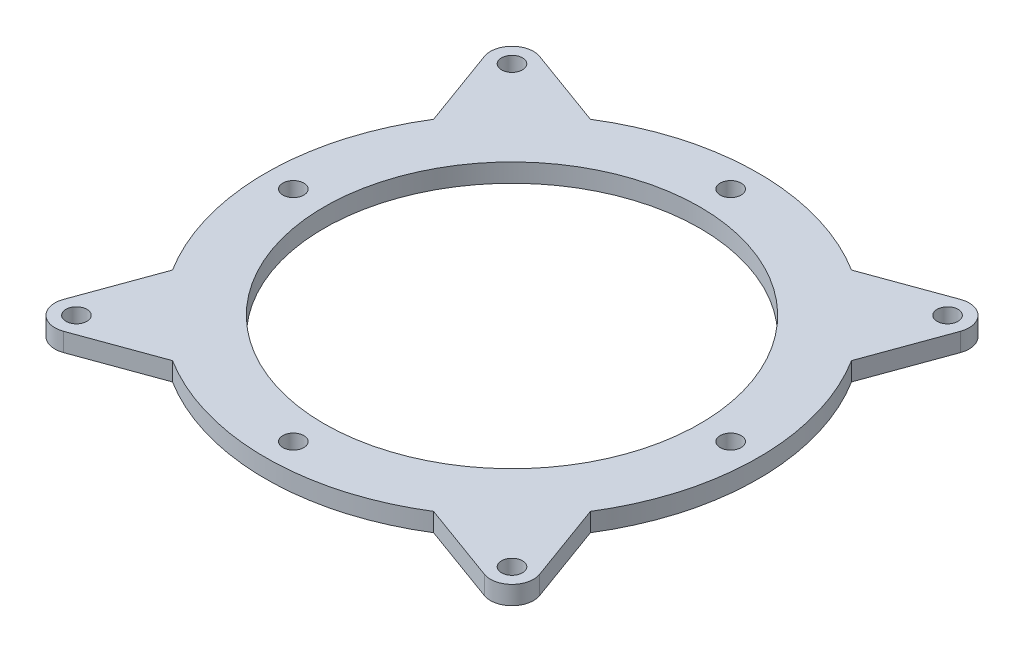
ISO-10303-21;
HEADER;
FILE_DESCRIPTION(('STEP AP214'),'2;1');
FILE_NAME('part.step','',(''),(''),'','','');
FILE_SCHEMA(('AUTOMOTIVE_DESIGN { 1 0 10303 214 1 1 1 1 }'));
ENDSEC;
DATA;
#1=APPLICATION_CONTEXT('core data for automotive mechanical design processes');
#2=APPLICATION_PROTOCOL_DEFINITION('international standard','automotive_design',2000,#1);
#3=PRODUCT_CONTEXT('',#1,'mechanical');
#4=PRODUCT('Part','Part','',(#3));
#5=PRODUCT_RELATED_PRODUCT_CATEGORY('part','',(#4));
#6=PRODUCT_DEFINITION_FORMATION('','',#4);
#7=PRODUCT_DEFINITION_CONTEXT('part definition',#1,'design');
#8=PRODUCT_DEFINITION('design','',#6,#7);
#9=PRODUCT_DEFINITION_SHAPE('','',#8);
#10=(LENGTH_UNIT() NAMED_UNIT(*) SI_UNIT(.MILLI.,.METRE.));
#11=(NAMED_UNIT(*) PLANE_ANGLE_UNIT() SI_UNIT($,.RADIAN.));
#12=(NAMED_UNIT(*) SI_UNIT($,.STERADIAN.) SOLID_ANGLE_UNIT());
#13=UNCERTAINTY_MEASURE_WITH_UNIT(LENGTH_MEASURE(1.E-05),#10,'distance_accuracy_value','');
#14=(GEOMETRIC_REPRESENTATION_CONTEXT(3) GLOBAL_UNCERTAINTY_ASSIGNED_CONTEXT((#13)) GLOBAL_UNIT_ASSIGNED_CONTEXT((#10,
#11,#12)) REPRESENTATION_CONTEXT('',''));
#15=CARTESIAN_POINT('',(0.,0.,0.));
#16=DIRECTION('',(0.,0.,1.));
#17=DIRECTION('',(1.,0.,0.));
#18=AXIS2_PLACEMENT_3D('',#15,#16,#17);
#19=CARTESIAN_POINT('',(35.3553390593273,3.,-35.3553390593275));
#20=DIRECTION('',(0.,1.,0.));
#21=DIRECTION('',(0.,0.,1.));
#22=AXIS2_PLACEMENT_3D('',#19,#20,#21);
#23=PLANE('',#22);
#24=CARTESIAN_POINT('',(-35.3553390593273,3.,35.3553390593275));
#25=DIRECTION('',(0.,1.,0.));
#26=DIRECTION('',(0.,0.,1.));
#27=AXIS2_PLACEMENT_3D('',#24,#25,#26);
#28=CIRCLE('',#27,1.69999999999999);
#29=CARTESIAN_POINT('',(-35.3553390593273,3.,37.0553390593275));
#30=VERTEX_POINT('',#29);
#31=EDGE_CURVE('E369',#30,#30,#28,.T.);
#32=ORIENTED_EDGE('',*,*,#31,.F.);
#33=EDGE_LOOP('',(#32));
#34=FACE_BOUND('',#33,.T.);
#35=CARTESIAN_POINT('',(-35.5,3.,0.));
#36=DIRECTION('',(0.,1.,0.));
#37=DIRECTION('',(0.,0.,1.));
#38=AXIS2_PLACEMENT_3D('',#35,#36,#37);
#39=CIRCLE('',#38,1.7);
#40=CARTESIAN_POINT('',(-35.5,3.,1.7));
#41=VERTEX_POINT('',#40);
#42=EDGE_CURVE('E381',#41,#41,#39,.T.);
#43=ORIENTED_EDGE('',*,*,#42,.F.);
#44=EDGE_LOOP('',(#43));
#45=FACE_BOUND('',#44,.T.);
#46=CARTESIAN_POINT('',(35.5,3.,0.));
#47=DIRECTION('',(0.,1.,0.));
#48=DIRECTION('',(0.,0.,1.));
#49=AXIS2_PLACEMENT_3D('',#46,#47,#48);
#50=CIRCLE('',#49,1.7);
#51=CARTESIAN_POINT('',(35.5,3.,1.7));
#52=VERTEX_POINT('',#51);
#53=EDGE_CURVE('E393',#52,#52,#50,.T.);
#54=ORIENTED_EDGE('',*,*,#53,.F.);
#55=EDGE_LOOP('',(#54));
#56=FACE_BOUND('',#55,.T.);
#57=CARTESIAN_POINT('',(0.,3.,0.));
#58=DIRECTION('',(0.,1.,0.));
#59=DIRECTION('',(0.,0.,1.));
#60=AXIS2_PLACEMENT_3D('',#57,#58,#59);
#61=CIRCLE('',#60,30.5);
#62=CARTESIAN_POINT('',(0.,3.,30.5));
#63=VERTEX_POINT('',#62);
#64=EDGE_CURVE('E405',#63,#63,#61,.T.);
#65=ORIENTED_EDGE('',*,*,#64,.F.);
#66=EDGE_LOOP('',(#65));
#67=FACE_BOUND('',#66,.T.);
#68=CARTESIAN_POINT('',(35.3553390593273,3.,-35.3553390593275));
#69=DIRECTION('',(0.,1.,0.));
#70=DIRECTION('',(0.,0.,1.));
#71=AXIS2_PLACEMENT_3D('',#68,#69,#70);
#72=CIRCLE('',#71,3.50000000000002);
#73=CARTESIAN_POINT('',(38.6442632320781,3.,-34.1582685576877));
#74=VERTEX_POINT('',#73);
#75=CARTESIAN_POINT('',(34.1582685576875,3.,-38.6442632320781));
#76=VERTEX_POINT('',#75);
#77=EDGE_CURVE('E215',#74,#76,#72,.T.);
#78=ORIENTED_EDGE('',*,*,#77,.T.);
#79=DIRECTION('',(-0.939692620785906,0.,0.342020143325677));
#80=VECTOR('',#79,1.);
#81=CARTESIAN_POINT('',(34.1582685576875,3.,-38.6442632320781));
#82=LINE('',#81,#80);
#83=CARTESIAN_POINT('',(21.1919766699055,3.,-33.9249189361181));
#84=VERTEX_POINT('',#83);
#85=EDGE_CURVE('E123',#76,#84,#82,.T.);
#86=ORIENTED_EDGE('',*,*,#85,.T.);
#87=CARTESIAN_POINT('',(0.,3.,0.));
#88=DIRECTION('',(0.,1.,0.));
#89=DIRECTION('',(0.,0.,1.));
#90=AXIS2_PLACEMENT_3D('',#87,#88,#89);
#91=CIRCLE('',#90,40.);
#92=CARTESIAN_POINT('',(-21.1919766699056,3.,-33.924918936118));
#93=VERTEX_POINT('',#92);
#94=EDGE_CURVE('E254',#84,#93,#91,.T.);
#95=ORIENTED_EDGE('',*,*,#94,.T.);
#96=DIRECTION('',(-0.939692620785906,0.,-0.342020143325674));
#97=VECTOR('',#96,1.);
#98=CARTESIAN_POINT('',(-34.1582685576876,3.,-38.644263232078));
#99=LINE('',#98,#97);
#100=CARTESIAN_POINT('',(-34.1582685576876,3.,-38.644263232078));
#101=VERTEX_POINT('',#100);
#102=EDGE_CURVE('E273',#93,#101,#99,.T.);
#103=ORIENTED_EDGE('',*,*,#102,.T.);
#104=CARTESIAN_POINT('',(-35.3553390593275,3.,-35.3553390593273));
#105=DIRECTION('',(0.,1.,0.));
#106=DIRECTION('',(0.,0.,1.));
#107=AXIS2_PLACEMENT_3D('',#104,#105,#106);
#108=CIRCLE('',#107,3.5);
#109=CARTESIAN_POINT('',(-38.6442632320781,3.,-34.1582685576875));
#110=VERTEX_POINT('',#109);
#111=EDGE_CURVE('E270',#101,#110,#108,.T.);
#112=ORIENTED_EDGE('',*,*,#111,.T.);
#113=DIRECTION('',(0.342020143325678,0.,0.939692620785905));
#114=VECTOR('',#113,1.);
#115=CARTESIAN_POINT('',(-38.6442632320782,3.,-34.1582685576875));
#116=LINE('',#115,#114);
#117=CARTESIAN_POINT('',(-33.924918936118,3.,-21.1919766699055));
#118=VERTEX_POINT('',#117);
#119=EDGE_CURVE('E272',#110,#118,#116,.T.);
#120=ORIENTED_EDGE('',*,*,#119,.T.);
#121=CARTESIAN_POINT('',(0.,3.,0.));
#122=DIRECTION('',(0.,1.,0.));
#123=DIRECTION('',(0.,0.,1.));
#124=AXIS2_PLACEMENT_3D('',#121,#122,#123);
#125=CIRCLE('',#124,40.);
#126=CARTESIAN_POINT('',(-33.924918936118,3.,21.1919766699056));
#127=VERTEX_POINT('',#126);
#128=EDGE_CURVE('E275',#118,#127,#125,.T.);
#129=ORIENTED_EDGE('',*,*,#128,.T.);
#130=DIRECTION('',(-0.342020143325674,0.,0.939692620785907));
#131=VECTOR('',#130,1.);
#132=CARTESIAN_POINT('',(-38.644263232078,3.,34.1582685576876));
#133=LINE('',#132,#131);
#134=CARTESIAN_POINT('',(-38.644263232078,3.,34.1582685576876));
#135=VERTEX_POINT('',#134);
#136=EDGE_CURVE('E281',#127,#135,#133,.T.);
#137=ORIENTED_EDGE('',*,*,#136,.T.);
#138=CARTESIAN_POINT('',(-35.3553390593273,3.,35.3553390593275));
#139=DIRECTION('',(0.,1.,0.));
#140=DIRECTION('',(0.,0.,1.));
#141=AXIS2_PLACEMENT_3D('',#138,#139,#140);
#142=CIRCLE('',#141,3.5);
#143=CARTESIAN_POINT('',(-34.1582685576875,3.,38.6442632320781));
#144=VERTEX_POINT('',#143);
#145=EDGE_CURVE('E283',#135,#144,#142,.T.);
#146=ORIENTED_EDGE('',*,*,#145,.T.);
#147=DIRECTION('',(0.939692620785905,0.,-0.342020143325678));
#148=VECTOR('',#147,1.);
#149=CARTESIAN_POINT('',(-34.1582685576875,3.,38.6442632320782));
#150=LINE('',#149,#148);
#151=CARTESIAN_POINT('',(-21.1919766699055,3.,33.924918936118));
#152=VERTEX_POINT('',#151);
#153=EDGE_CURVE('E285',#144,#152,#150,.T.);
#154=ORIENTED_EDGE('',*,*,#153,.T.);
#155=CARTESIAN_POINT('',(0.,3.,0.));
#156=DIRECTION('',(0.,1.,0.));
#157=DIRECTION('',(0.,0.,1.));
#158=AXIS2_PLACEMENT_3D('',#155,#156,#157);
#159=CIRCLE('',#158,40.);
#160=CARTESIAN_POINT('',(21.1919766699056,3.,33.924918936118));
#161=VERTEX_POINT('',#160);
#162=EDGE_CURVE('E287',#152,#161,#159,.T.);
#163=ORIENTED_EDGE('',*,*,#162,.T.);
#164=DIRECTION('',(0.939692620785906,0.,0.342020143325674));
#165=VECTOR('',#164,1.);
#166=CARTESIAN_POINT('',(34.1582685576876,3.,38.644263232078));
#167=LINE('',#166,#165);
#168=CARTESIAN_POINT('',(34.1582685576876,3.,38.644263232078));
#169=VERTEX_POINT('',#168);
#170=EDGE_CURVE('E289',#161,#169,#167,.T.);
#171=ORIENTED_EDGE('',*,*,#170,.T.);
#172=CARTESIAN_POINT('',(35.3553390593275,3.,35.3553390593273));
#173=DIRECTION('',(0.,1.,0.));
#174=DIRECTION('',(0.,0.,1.));
#175=AXIS2_PLACEMENT_3D('',#172,#173,#174);
#176=CIRCLE('',#175,3.5);
#177=CARTESIAN_POINT('',(38.6442632320781,3.,34.1582685576875));
#178=VERTEX_POINT('',#177);
#179=EDGE_CURVE('E166',#169,#178,#176,.T.);
#180=ORIENTED_EDGE('',*,*,#179,.T.);
#181=DIRECTION('',(-0.342020143325678,0.,-0.939692620785905));
#182=VECTOR('',#181,1.);
#183=CARTESIAN_POINT('',(38.6442632320781,3.,34.1582685576875));
#184=LINE('',#183,#182);
#185=CARTESIAN_POINT('',(33.924918936118,3.,21.1919766699055));
#186=VERTEX_POINT('',#185);
#187=EDGE_CURVE('E160',#178,#186,#184,.T.);
#188=ORIENTED_EDGE('',*,*,#187,.T.);
#189=CARTESIAN_POINT('',(0.,3.,0.));
#190=DIRECTION('',(0.,1.,0.));
#191=DIRECTION('',(0.,0.,1.));
#192=AXIS2_PLACEMENT_3D('',#189,#190,#191);
#193=CIRCLE('',#192,40.);
#194=CARTESIAN_POINT('',(33.924918936118,3.,-21.1919766699056));
#195=VERTEX_POINT('',#194);
#196=EDGE_CURVE('E164',#186,#195,#193,.T.);
#197=ORIENTED_EDGE('',*,*,#196,.T.);
#198=DIRECTION('',(0.342020143325675,0.,-0.939692620785906));
#199=VECTOR('',#198,1.);
#200=CARTESIAN_POINT('',(38.6442632320781,3.,-34.1582685576877));
#201=LINE('',#200,#199);
#202=EDGE_CURVE('E56',#195,#74,#201,.T.);
#203=ORIENTED_EDGE('',*,*,#202,.T.);
#204=EDGE_LOOP('',(#78,#86,#95,#103,#112,#120,#129,#137,#146,#154,#163,#171,#180,#188,#197,#203));
#205=FACE_BOUND('',#204,.T.);
#206=CARTESIAN_POINT('',(35.3553390593273,3.,-35.3553390593275));
#207=DIRECTION('',(0.,1.,0.));
#208=DIRECTION('',(0.,0.,1.));
#209=AXIS2_PLACEMENT_3D('',#206,#207,#208);
#210=CIRCLE('',#209,1.7);
#211=CARTESIAN_POINT('',(35.3553390593273,3.,-33.6553390593275));
#212=VERTEX_POINT('',#211);
#213=EDGE_CURVE('E188',#212,#212,#210,.T.);
#214=ORIENTED_EDGE('',*,*,#213,.F.);
#215=EDGE_LOOP('',(#214));
#216=FACE_BOUND('',#215,.T.);
#217=CARTESIAN_POINT('',(0.,3.,-35.5));
#218=DIRECTION('',(0.,1.,0.));
#219=DIRECTION('',(0.,0.,1.));
#220=AXIS2_PLACEMENT_3D('',#217,#218,#219);
#221=CIRCLE('',#220,1.7);
#222=CARTESIAN_POINT('',(0.,3.,-33.8));
#223=VERTEX_POINT('',#222);
#224=EDGE_CURVE('E399',#223,#223,#221,.T.);
#225=ORIENTED_EDGE('',*,*,#224,.F.);
#226=EDGE_LOOP('',(#225));
#227=FACE_BOUND('',#226,.T.);
#228=CARTESIAN_POINT('',(0.,3.,35.5));
#229=DIRECTION('',(0.,1.,0.));
#230=DIRECTION('',(0.,0.,1.));
#231=AXIS2_PLACEMENT_3D('',#228,#229,#230);
#232=CIRCLE('',#231,1.7);
#233=CARTESIAN_POINT('',(0.,3.,37.2));
#234=VERTEX_POINT('',#233);
#235=EDGE_CURVE('E387',#234,#234,#232,.T.);
#236=ORIENTED_EDGE('',*,*,#235,.F.);
#237=EDGE_LOOP('',(#236));
#238=FACE_BOUND('',#237,.T.);
#239=CARTESIAN_POINT('',(35.3553390593275,3.,35.3553390593273));
#240=DIRECTION('',(0.,1.,0.));
#241=DIRECTION('',(0.,0.,1.));
#242=AXIS2_PLACEMENT_3D('',#239,#240,#241);
#243=CIRCLE('',#242,1.7);
#244=CARTESIAN_POINT('',(35.3553390593275,3.,37.0553390593273));
#245=VERTEX_POINT('',#244);
#246=EDGE_CURVE('E375',#245,#245,#243,.T.);
#247=ORIENTED_EDGE('',*,*,#246,.F.);
#248=EDGE_LOOP('',(#247));
#249=FACE_BOUND('',#248,.T.);
#250=CARTESIAN_POINT('',(-35.3553390593275,3.,-35.3553390593273));
#251=DIRECTION('',(0.,1.,0.));
#252=DIRECTION('',(0.,0.,1.));
#253=AXIS2_PLACEMENT_3D('',#250,#251,#252);
#254=CIRCLE('',#253,1.7);
#255=CARTESIAN_POINT('',(-35.3553390593275,3.,-33.6553390593273));
#256=VERTEX_POINT('',#255);
#257=EDGE_CURVE('E360',#256,#256,#254,.T.);
#258=ORIENTED_EDGE('',*,*,#257,.F.);
#259=EDGE_LOOP('',(#258));
#260=FACE_BOUND('',#259,.T.);
#261=ADVANCED_FACE('F39',(#34,#45,#56,#67,#205,#216,#227,#238,#249,#260),#23,.T.);
#262=CARTESIAN_POINT('',(35.3553390593273,0.,-35.3553390593275));
#263=DIRECTION('',(0.,1.,0.));
#264=DIRECTION('',(0.,0.,1.));
#265=AXIS2_PLACEMENT_3D('',#262,#263,#264);
#266=PLANE('',#265);
#267=CARTESIAN_POINT('',(35.3553390593273,0.,-35.3553390593275));
#268=DIRECTION('',(0.,1.,0.));
#269=DIRECTION('',(0.,0.,1.));
#270=AXIS2_PLACEMENT_3D('',#267,#268,#269);
#271=CIRCLE('',#270,3.50000000000002);
#272=CARTESIAN_POINT('',(38.6442632320781,0.,-34.1582685576877));
#273=VERTEX_POINT('',#272);
#274=CARTESIAN_POINT('',(34.1582685576875,0.,-38.6442632320781));
#275=VERTEX_POINT('',#274);
#276=EDGE_CURVE('E184',#273,#275,#271,.T.);
#277=ORIENTED_EDGE('',*,*,#276,.F.);
#278=DIRECTION('',(0.342020143325675,0.,-0.939692620785906));
#279=VECTOR('',#278,1.);
#280=CARTESIAN_POINT('',(38.6442632320781,0.,-34.1582685576877));
#281=LINE('',#280,#279);
#282=CARTESIAN_POINT('',(33.924918936118,0.,-21.1919766699056));
#283=VERTEX_POINT('',#282);
#284=EDGE_CURVE('E115',#283,#273,#281,.T.);
#285=ORIENTED_EDGE('',*,*,#284,.F.);
#286=CARTESIAN_POINT('',(0.,0.,0.));
#287=DIRECTION('',(0.,1.,0.));
#288=DIRECTION('',(0.,0.,1.));
#289=AXIS2_PLACEMENT_3D('',#286,#287,#288);
#290=CIRCLE('',#289,40.);
#291=CARTESIAN_POINT('',(33.924918936118,0.,21.1919766699055));
#292=VERTEX_POINT('',#291);
#293=EDGE_CURVE('E109',#292,#283,#290,.T.);
#294=ORIENTED_EDGE('',*,*,#293,.F.);
#295=DIRECTION('',(-0.342020143325678,0.,-0.939692620785905));
#296=VECTOR('',#295,1.);
#297=CARTESIAN_POINT('',(38.6442632320781,0.,34.1582685576875));
#298=LINE('',#297,#296);
#299=CARTESIAN_POINT('',(38.6442632320781,0.,34.1582685576875));
#300=VERTEX_POINT('',#299);
#301=EDGE_CURVE('E174',#300,#292,#298,.T.);
#302=ORIENTED_EDGE('',*,*,#301,.F.);
#303=CARTESIAN_POINT('',(35.3553390593275,0.,35.3553390593273));
#304=DIRECTION('',(0.,1.,0.));
#305=DIRECTION('',(0.,0.,1.));
#306=AXIS2_PLACEMENT_3D('',#303,#304,#305);
#307=CIRCLE('',#306,3.5);
#308=CARTESIAN_POINT('',(34.1582685576876,0.,38.644263232078));
#309=VERTEX_POINT('',#308);
#310=EDGE_CURVE('E210',#309,#300,#307,.T.);
#311=ORIENTED_EDGE('',*,*,#310,.F.);
#312=DIRECTION('',(0.939692620785906,0.,0.342020143325674));
#313=VECTOR('',#312,1.);
#314=CARTESIAN_POINT('',(34.1582685576876,0.,38.644263232078));
#315=LINE('',#314,#313);
#316=CARTESIAN_POINT('',(21.1919766699056,0.,33.924918936118));
#317=VERTEX_POINT('',#316);
#318=EDGE_CURVE('E208',#317,#309,#315,.T.);
#319=ORIENTED_EDGE('',*,*,#318,.F.);
#320=CARTESIAN_POINT('',(0.,0.,0.));
#321=DIRECTION('',(0.,1.,0.));
#322=DIRECTION('',(0.,0.,1.));
#323=AXIS2_PLACEMENT_3D('',#320,#321,#322);
#324=CIRCLE('',#323,40.);
#325=CARTESIAN_POINT('',(-21.1919766699055,0.,33.924918936118));
#326=VERTEX_POINT('',#325);
#327=EDGE_CURVE('E206',#326,#317,#324,.T.);
#328=ORIENTED_EDGE('',*,*,#327,.F.);
#329=DIRECTION('',(0.939692620785905,0.,-0.342020143325678));
#330=VECTOR('',#329,1.);
#331=CARTESIAN_POINT('',(-34.1582685576875,0.,38.6442632320782));
#332=LINE('',#331,#330);
#333=CARTESIAN_POINT('',(-34.1582685576875,0.,38.6442632320781));
#334=VERTEX_POINT('',#333);
#335=EDGE_CURVE('E204',#334,#326,#332,.T.);
#336=ORIENTED_EDGE('',*,*,#335,.F.);
#337=CARTESIAN_POINT('',(-35.3553390593273,0.,35.3553390593275));
#338=DIRECTION('',(0.,1.,0.));
#339=DIRECTION('',(0.,0.,1.));
#340=AXIS2_PLACEMENT_3D('',#337,#338,#339);
#341=CIRCLE('',#340,3.5);
#342=CARTESIAN_POINT('',(-38.644263232078,0.,34.1582685576876));
#343=VERTEX_POINT('',#342);
#344=EDGE_CURVE('E202',#343,#334,#341,.T.);
#345=ORIENTED_EDGE('',*,*,#344,.F.);
#346=DIRECTION('',(-0.342020143325674,0.,0.939692620785907));
#347=VECTOR('',#346,1.);
#348=CARTESIAN_POINT('',(-38.644263232078,0.,34.1582685576876));
#349=LINE('',#348,#347);
#350=CARTESIAN_POINT('',(-33.924918936118,0.,21.1919766699056));
#351=VERTEX_POINT('',#350);
#352=EDGE_CURVE('E200',#351,#343,#349,.T.);
#353=ORIENTED_EDGE('',*,*,#352,.F.);
#354=CARTESIAN_POINT('',(0.,0.,0.));
#355=DIRECTION('',(0.,1.,0.));
#356=DIRECTION('',(0.,0.,1.));
#357=AXIS2_PLACEMENT_3D('',#354,#355,#356);
#358=CIRCLE('',#357,40.);
#359=CARTESIAN_POINT('',(-33.924918936118,0.,-21.1919766699055));
#360=VERTEX_POINT('',#359);
#361=EDGE_CURVE('E198',#360,#351,#358,.T.);
#362=ORIENTED_EDGE('',*,*,#361,.F.);
#363=DIRECTION('',(0.342020143325678,0.,0.939692620785905));
#364=VECTOR('',#363,1.);
#365=CARTESIAN_POINT('',(-38.6442632320782,0.,-34.1582685576875));
#366=LINE('',#365,#364);
#367=CARTESIAN_POINT('',(-38.6442632320781,0.,-34.1582685576875));
#368=VERTEX_POINT('',#367);
#369=EDGE_CURVE('E196',#368,#360,#366,.T.);
#370=ORIENTED_EDGE('',*,*,#369,.F.);
#371=CARTESIAN_POINT('',(-35.3553390593275,0.,-35.3553390593273));
#372=DIRECTION('',(0.,1.,0.));
#373=DIRECTION('',(0.,0.,1.));
#374=AXIS2_PLACEMENT_3D('',#371,#372,#373);
#375=CIRCLE('',#374,3.5);
#376=CARTESIAN_POINT('',(-34.1582685576876,0.,-38.644263232078));
#377=VERTEX_POINT('',#376);
#378=EDGE_CURVE('E194',#377,#368,#375,.T.);
#379=ORIENTED_EDGE('',*,*,#378,.F.);
#380=DIRECTION('',(-0.939692620785906,0.,-0.342020143325674));
#381=VECTOR('',#380,1.);
#382=CARTESIAN_POINT('',(-34.1582685576876,0.,-38.644263232078));
#383=LINE('',#382,#381);
#384=CARTESIAN_POINT('',(-21.1919766699056,0.,-33.924918936118));
#385=VERTEX_POINT('',#384);
#386=EDGE_CURVE('E192',#385,#377,#383,.T.);
#387=ORIENTED_EDGE('',*,*,#386,.F.);
#388=CARTESIAN_POINT('',(0.,0.,0.));
#389=DIRECTION('',(0.,1.,0.));
#390=DIRECTION('',(0.,0.,1.));
#391=AXIS2_PLACEMENT_3D('',#388,#389,#390);
#392=CIRCLE('',#391,40.);
#393=CARTESIAN_POINT('',(21.1919766699055,0.,-33.9249189361181));
#394=VERTEX_POINT('',#393);
#395=EDGE_CURVE('E190',#394,#385,#392,.T.);
#396=ORIENTED_EDGE('',*,*,#395,.F.);
#397=DIRECTION('',(-0.939692620785906,0.,0.342020143325677));
#398=VECTOR('',#397,1.);
#399=CARTESIAN_POINT('',(34.1582685576875,0.,-38.6442632320781));
#400=LINE('',#399,#398);
#401=EDGE_CURVE('E187',#275,#394,#400,.T.);
#402=ORIENTED_EDGE('',*,*,#401,.F.);
#403=EDGE_LOOP('',(#277,#285,#294,#302,#311,#319,#328,#336,#345,#353,#362,#370,#379,#387,#396,#402));
#404=FACE_BOUND('',#403,.T.);
#405=CARTESIAN_POINT('',(35.3553390593273,0.,-35.3553390593275));
#406=DIRECTION('',(0.,1.,0.));
#407=DIRECTION('',(0.,0.,1.));
#408=AXIS2_PLACEMENT_3D('',#405,#406,#407);
#409=CIRCLE('',#408,1.7);
#410=CARTESIAN_POINT('',(35.3553390593273,0.,-33.6553390593275));
#411=VERTEX_POINT('',#410);
#412=EDGE_CURVE('E408',#411,#411,#409,.T.);
#413=ORIENTED_EDGE('',*,*,#412,.T.);
#414=EDGE_LOOP('',(#413));
#415=FACE_BOUND('',#414,.T.);
#416=CARTESIAN_POINT('',(0.,0.,0.));
#417=DIRECTION('',(0.,1.,0.));
#418=DIRECTION('',(0.,0.,1.));
#419=AXIS2_PLACEMENT_3D('',#416,#417,#418);
#420=CIRCLE('',#419,30.5);
#421=CARTESIAN_POINT('',(0.,0.,30.5));
#422=VERTEX_POINT('',#421);
#423=EDGE_CURVE('E402',#422,#422,#420,.T.);
#424=ORIENTED_EDGE('',*,*,#423,.T.);
#425=EDGE_LOOP('',(#424));
#426=FACE_BOUND('',#425,.T.);
#427=CARTESIAN_POINT('',(0.,0.,-35.5));
#428=DIRECTION('',(0.,1.,0.));
#429=DIRECTION('',(0.,0.,1.));
#430=AXIS2_PLACEMENT_3D('',#427,#428,#429);
#431=CIRCLE('',#430,1.7);
#432=CARTESIAN_POINT('',(0.,0.,-33.8));
#433=VERTEX_POINT('',#432);
#434=EDGE_CURVE('E396',#433,#433,#431,.T.);
#435=ORIENTED_EDGE('',*,*,#434,.T.);
#436=EDGE_LOOP('',(#435));
#437=FACE_BOUND('',#436,.T.);
#438=CARTESIAN_POINT('',(35.5,0.,0.));
#439=DIRECTION('',(0.,1.,0.));
#440=DIRECTION('',(0.,0.,1.));
#441=AXIS2_PLACEMENT_3D('',#438,#439,#440);
#442=CIRCLE('',#441,1.7);
#443=CARTESIAN_POINT('',(35.5,0.,1.7));
#444=VERTEX_POINT('',#443);
#445=EDGE_CURVE('E390',#444,#444,#442,.T.);
#446=ORIENTED_EDGE('',*,*,#445,.T.);
#447=EDGE_LOOP('',(#446));
#448=FACE_BOUND('',#447,.T.);
#449=CARTESIAN_POINT('',(0.,0.,35.5));
#450=DIRECTION('',(0.,1.,0.));
#451=DIRECTION('',(0.,0.,1.));
#452=AXIS2_PLACEMENT_3D('',#449,#450,#451);
#453=CIRCLE('',#452,1.7);
#454=CARTESIAN_POINT('',(0.,0.,37.2));
#455=VERTEX_POINT('',#454);
#456=EDGE_CURVE('E384',#455,#455,#453,.T.);
#457=ORIENTED_EDGE('',*,*,#456,.T.);
#458=EDGE_LOOP('',(#457));
#459=FACE_BOUND('',#458,.T.);
#460=CARTESIAN_POINT('',(-35.5,0.,0.));
#461=DIRECTION('',(0.,1.,0.));
#462=DIRECTION('',(0.,0.,1.));
#463=AXIS2_PLACEMENT_3D('',#460,#461,#462);
#464=CIRCLE('',#463,1.7);
#465=CARTESIAN_POINT('',(-35.5,0.,1.7));
#466=VERTEX_POINT('',#465);
#467=EDGE_CURVE('E378',#466,#466,#464,.T.);
#468=ORIENTED_EDGE('',*,*,#467,.T.);
#469=EDGE_LOOP('',(#468));
#470=FACE_BOUND('',#469,.T.);
#471=CARTESIAN_POINT('',(35.3553390593275,0.,35.3553390593273));
#472=DIRECTION('',(0.,1.,0.));
#473=DIRECTION('',(0.,0.,1.));
#474=AXIS2_PLACEMENT_3D('',#471,#472,#473);
#475=CIRCLE('',#474,1.7);
#476=CARTESIAN_POINT('',(35.3553390593275,0.,37.0553390593273));
#477=VERTEX_POINT('',#476);
#478=EDGE_CURVE('E372',#477,#477,#475,.T.);
#479=ORIENTED_EDGE('',*,*,#478,.T.);
#480=EDGE_LOOP('',(#479));
#481=FACE_BOUND('',#480,.T.);
#482=CARTESIAN_POINT('',(-35.3553390593273,0.,35.3553390593275));
#483=DIRECTION('',(0.,1.,0.));
#484=DIRECTION('',(0.,0.,1.));
#485=AXIS2_PLACEMENT_3D('',#482,#483,#484);
#486=CIRCLE('',#485,1.69999999999999);
#487=CARTESIAN_POINT('',(-35.3553390593273,0.,37.0553390593275));
#488=VERTEX_POINT('',#487);
#489=EDGE_CURVE('E366',#488,#488,#486,.T.);
#490=ORIENTED_EDGE('',*,*,#489,.T.);
#491=EDGE_LOOP('',(#490));
#492=FACE_BOUND('',#491,.T.);
#493=CARTESIAN_POINT('',(-35.3553390593275,0.,-35.3553390593273));
#494=DIRECTION('',(0.,1.,0.));
#495=DIRECTION('',(0.,0.,1.));
#496=AXIS2_PLACEMENT_3D('',#493,#494,#495);
#497=CIRCLE('',#496,1.7);
#498=CARTESIAN_POINT('',(-35.3553390593275,0.,-33.6553390593273));
#499=VERTEX_POINT('',#498);
#500=EDGE_CURVE('E363',#499,#499,#497,.T.);
#501=ORIENTED_EDGE('',*,*,#500,.T.);
#502=EDGE_LOOP('',(#501));
#503=FACE_BOUND('',#502,.T.);
#504=ADVANCED_FACE('F258',(#404,#415,#426,#437,#448,#459,#470,#481,#492,#503),#266,.F.);
#505=CARTESIAN_POINT('',(35.3553390593273,3.,-35.3553390593275));
#506=DIRECTION('',(0.,-1.,0.));
#507=DIRECTION('',(0.,0.,-1.));
#508=AXIS2_PLACEMENT_3D('',#505,#506,#507);
#509=CYLINDRICAL_SURFACE('',#508,3.50000000000002);
#510=ORIENTED_EDGE('',*,*,#276,.T.);
#511=DIRECTION('',(0.,-1.,0.));
#512=VECTOR('',#511,1.);
#513=CARTESIAN_POINT('',(34.1582685576875,3.,-38.6442632320781));
#514=LINE('',#513,#512);
#515=EDGE_CURVE('E11',#76,#275,#514,.T.);
#516=ORIENTED_EDGE('',*,*,#515,.F.);
#517=ORIENTED_EDGE('',*,*,#77,.F.);
#518=DIRECTION('',(0.,-1.,0.));
#519=VECTOR('',#518,1.);
#520=CARTESIAN_POINT('',(38.6442632320781,3.,-34.1582685576877));
#521=LINE('',#520,#519);
#522=EDGE_CURVE('E180',#74,#273,#521,.T.);
#523=ORIENTED_EDGE('',*,*,#522,.T.);
#524=EDGE_LOOP('',(#510,#516,#517,#523));
#525=FACE_BOUND('',#524,.T.);
#526=ADVANCED_FACE('F41',(#525),#509,.T.);
#527=CARTESIAN_POINT('',(34.1582685576875,3.,-38.6442632320781));
#528=DIRECTION('',(0.342020143325677,0.,0.939692620785905));
#529=DIRECTION('',(0.939692620785905,0.,-0.342020143325677));
#530=AXIS2_PLACEMENT_3D('',#527,#528,#529);
#531=PLANE('',#530);
#532=ORIENTED_EDGE('',*,*,#401,.T.);
#533=DIRECTION('',(0.,-1.,0.));
#534=VECTOR('',#533,1.);
#535=CARTESIAN_POINT('',(21.1919766699055,3.,-33.9249189361181));
#536=LINE('',#535,#534);
#537=EDGE_CURVE('E48',#84,#394,#536,.T.);
#538=ORIENTED_EDGE('',*,*,#537,.F.);
#539=ORIENTED_EDGE('',*,*,#85,.F.);
#540=ORIENTED_EDGE('',*,*,#515,.T.);
#541=EDGE_LOOP('',(#532,#538,#539,#540));
#542=FACE_BOUND('',#541,.T.);
#543=ADVANCED_FACE('F612',(#542),#531,.F.);
#544=CARTESIAN_POINT('',(0.,3.,0.));
#545=DIRECTION('',(0.,-1.,0.));
#546=DIRECTION('',(0.,0.,-1.));
#547=AXIS2_PLACEMENT_3D('',#544,#545,#546);
#548=CYLINDRICAL_SURFACE('',#547,40.);
#549=ORIENTED_EDGE('',*,*,#395,.T.);
#550=DIRECTION('',(0.,-1.,0.));
#551=VECTOR('',#550,1.);
#552=CARTESIAN_POINT('',(-21.1919766699056,3.,-33.924918936118));
#553=LINE('',#552,#551);
#554=EDGE_CURVE('E246',#93,#385,#553,.T.);
#555=ORIENTED_EDGE('',*,*,#554,.F.);
#556=ORIENTED_EDGE('',*,*,#94,.F.);
#557=ORIENTED_EDGE('',*,*,#537,.T.);
#558=EDGE_LOOP('',(#549,#555,#556,#557));
#559=FACE_BOUND('',#558,.T.);
#560=ADVANCED_FACE('F252',(#559),#548,.T.);
#561=CARTESIAN_POINT('',(-34.1582685576876,3.,-38.644263232078));
#562=DIRECTION('',(-0.342020143325674,0.,0.939692620785906));
#563=DIRECTION('',(0.939692620785907,0.,0.342020143325674));
#564=AXIS2_PLACEMENT_3D('',#561,#562,#563);
#565=PLANE('',#564);
#566=ORIENTED_EDGE('',*,*,#386,.T.);
#567=DIRECTION('',(0.,-1.,0.));
#568=VECTOR('',#567,1.);
#569=CARTESIAN_POINT('',(-34.1582685576876,3.,-38.644263232078));
#570=LINE('',#569,#568);
#571=EDGE_CURVE('E243',#101,#377,#570,.T.);
#572=ORIENTED_EDGE('',*,*,#571,.F.);
#573=ORIENTED_EDGE('',*,*,#102,.F.);
#574=ORIENTED_EDGE('',*,*,#554,.T.);
#575=EDGE_LOOP('',(#566,#572,#573,#574));
#576=FACE_BOUND('',#575,.T.);
#577=ADVANCED_FACE('F264',(#576),#565,.F.);
#578=CARTESIAN_POINT('',(-35.3553390593275,3.,-35.3553390593273));
#579=DIRECTION('',(0.,-1.,0.));
#580=DIRECTION('',(0.,0.,-1.));
#581=AXIS2_PLACEMENT_3D('',#578,#579,#580);
#582=CYLINDRICAL_SURFACE('',#581,3.5);
#583=ORIENTED_EDGE('',*,*,#378,.T.);
#584=DIRECTION('',(0.,-1.,0.));
#585=VECTOR('',#584,1.);
#586=CARTESIAN_POINT('',(-38.6442632320781,3.,-34.1582685576875));
#587=LINE('',#586,#585);
#588=EDGE_CURVE('E240',#110,#368,#587,.T.);
#589=ORIENTED_EDGE('',*,*,#588,.F.);
#590=ORIENTED_EDGE('',*,*,#111,.F.);
#591=ORIENTED_EDGE('',*,*,#571,.T.);
#592=EDGE_LOOP('',(#583,#589,#590,#591));
#593=FACE_BOUND('',#592,.T.);
#594=ADVANCED_FACE('F268',(#593),#582,.T.);
#595=CARTESIAN_POINT('',(-38.6442632320782,3.,-34.1582685576875));
#596=DIRECTION('',(0.939692620785905,0.,-0.342020143325678));
#597=DIRECTION('',(-0.342020143325678,0.,-0.939692620785905));
#598=AXIS2_PLACEMENT_3D('',#595,#596,#597);
#599=PLANE('',#598);
#600=ORIENTED_EDGE('',*,*,#369,.T.);
#601=DIRECTION('',(0.,-1.,0.));
#602=VECTOR('',#601,1.);
#603=CARTESIAN_POINT('',(-33.924918936118,3.,-21.1919766699055));
#604=LINE('',#603,#602);
#605=EDGE_CURVE('E237',#118,#360,#604,.T.);
#606=ORIENTED_EDGE('',*,*,#605,.F.);
#607=ORIENTED_EDGE('',*,*,#119,.F.);
#608=ORIENTED_EDGE('',*,*,#588,.T.);
#609=EDGE_LOOP('',(#600,#606,#607,#608));
#610=FACE_BOUND('',#609,.T.);
#611=ADVANCED_FACE('F577',(#610),#599,.F.);
#612=CARTESIAN_POINT('',(0.,3.,0.));
#613=DIRECTION('',(0.,-1.,0.));
#614=DIRECTION('',(0.,0.,-1.));
#615=AXIS2_PLACEMENT_3D('',#612,#613,#614);
#616=CYLINDRICAL_SURFACE('',#615,40.);
#617=ORIENTED_EDGE('',*,*,#361,.T.);
#618=DIRECTION('',(0.,-1.,0.));
#619=VECTOR('',#618,1.);
#620=CARTESIAN_POINT('',(-33.924918936118,3.,21.1919766699056));
#621=LINE('',#620,#619);
#622=EDGE_CURVE('E234',#127,#351,#621,.T.);
#623=ORIENTED_EDGE('',*,*,#622,.F.);
#624=ORIENTED_EDGE('',*,*,#128,.F.);
#625=ORIENTED_EDGE('',*,*,#605,.T.);
#626=EDGE_LOOP('',(#617,#623,#624,#625));
#627=FACE_BOUND('',#626,.T.);
#628=ADVANCED_FACE('F567',(#627),#616,.T.);
#629=CARTESIAN_POINT('',(-38.644263232078,3.,34.1582685576876));
#630=DIRECTION('',(0.939692620785906,0.,0.342020143325674));
#631=DIRECTION('',(0.342020143325674,0.,-0.939692620785907));
#632=AXIS2_PLACEMENT_3D('',#629,#630,#631);
#633=PLANE('',#632);
#634=ORIENTED_EDGE('',*,*,#352,.T.);
#635=DIRECTION('',(0.,-1.,0.));
#636=VECTOR('',#635,1.);
#637=CARTESIAN_POINT('',(-38.644263232078,3.,34.1582685576876));
#638=LINE('',#637,#636);
#639=EDGE_CURVE('E231',#135,#343,#638,.T.);
#640=ORIENTED_EDGE('',*,*,#639,.F.);
#641=ORIENTED_EDGE('',*,*,#136,.F.);
#642=ORIENTED_EDGE('',*,*,#622,.T.);
#643=EDGE_LOOP('',(#634,#640,#641,#642));
#644=FACE_BOUND('',#643,.T.);
#645=ADVANCED_FACE('F557',(#644),#633,.F.);
#646=CARTESIAN_POINT('',(-35.3553390593273,3.,35.3553390593275));
#647=DIRECTION('',(0.,-1.,0.));
#648=DIRECTION('',(0.,0.,-1.));
#649=AXIS2_PLACEMENT_3D('',#646,#647,#648);
#650=CYLINDRICAL_SURFACE('',#649,3.5);
#651=ORIENTED_EDGE('',*,*,#344,.T.);
#652=DIRECTION('',(0.,-1.,0.));
#653=VECTOR('',#652,1.);
#654=CARTESIAN_POINT('',(-34.1582685576875,3.,38.6442632320781));
#655=LINE('',#654,#653);
#656=EDGE_CURVE('E228',#144,#334,#655,.T.);
#657=ORIENTED_EDGE('',*,*,#656,.F.);
#658=ORIENTED_EDGE('',*,*,#145,.F.);
#659=ORIENTED_EDGE('',*,*,#639,.T.);
#660=EDGE_LOOP('',(#651,#657,#658,#659));
#661=FACE_BOUND('',#660,.T.);
#662=ADVANCED_FACE('F547',(#661),#650,.T.);
#663=CARTESIAN_POINT('',(-34.1582685576875,3.,38.6442632320782));
#664=DIRECTION('',(-0.342020143325678,0.,-0.939692620785905));
#665=DIRECTION('',(-0.939692620785905,0.,0.342020143325678));
#666=AXIS2_PLACEMENT_3D('',#663,#664,#665);
#667=PLANE('',#666);
#668=ORIENTED_EDGE('',*,*,#335,.T.);
#669=DIRECTION('',(0.,-1.,0.));
#670=VECTOR('',#669,1.);
#671=CARTESIAN_POINT('',(-21.1919766699055,3.,33.924918936118));
#672=LINE('',#671,#670);
#673=EDGE_CURVE('E225',#152,#326,#672,.T.);
#674=ORIENTED_EDGE('',*,*,#673,.F.);
#675=ORIENTED_EDGE('',*,*,#153,.F.);
#676=ORIENTED_EDGE('',*,*,#656,.T.);
#677=EDGE_LOOP('',(#668,#674,#675,#676));
#678=FACE_BOUND('',#677,.T.);
#679=ADVANCED_FACE('F537',(#678),#667,.F.);
#680=CARTESIAN_POINT('',(0.,3.,0.));
#681=DIRECTION('',(0.,-1.,0.));
#682=DIRECTION('',(0.,0.,-1.));
#683=AXIS2_PLACEMENT_3D('',#680,#681,#682);
#684=CYLINDRICAL_SURFACE('',#683,40.);
#685=ORIENTED_EDGE('',*,*,#327,.T.);
#686=DIRECTION('',(0.,-1.,0.));
#687=VECTOR('',#686,1.);
#688=CARTESIAN_POINT('',(21.1919766699056,3.,33.924918936118));
#689=LINE('',#688,#687);
#690=EDGE_CURVE('E222',#161,#317,#689,.T.);
#691=ORIENTED_EDGE('',*,*,#690,.F.);
#692=ORIENTED_EDGE('',*,*,#162,.F.);
#693=ORIENTED_EDGE('',*,*,#673,.T.);
#694=EDGE_LOOP('',(#685,#691,#692,#693));
#695=FACE_BOUND('',#694,.T.);
#696=ADVANCED_FACE('F528',(#695),#684,.T.);
#697=CARTESIAN_POINT('',(34.1582685576876,3.,38.644263232078));
#698=DIRECTION('',(0.342020143325674,0.,-0.939692620785906));
#699=DIRECTION('',(-0.939692620785907,0.,-0.342020143325674));
#700=AXIS2_PLACEMENT_3D('',#697,#698,#699);
#701=PLANE('',#700);
#702=ORIENTED_EDGE('',*,*,#318,.T.);
#703=DIRECTION('',(0.,-1.,0.));
#704=VECTOR('',#703,1.);
#705=CARTESIAN_POINT('',(34.1582685576876,3.,38.644263232078));
#706=LINE('',#705,#704);
#707=EDGE_CURVE('E219',#169,#309,#706,.T.);
#708=ORIENTED_EDGE('',*,*,#707,.F.);
#709=ORIENTED_EDGE('',*,*,#170,.F.);
#710=ORIENTED_EDGE('',*,*,#690,.T.);
#711=EDGE_LOOP('',(#702,#708,#709,#710));
#712=FACE_BOUND('',#711,.T.);
#713=ADVANCED_FACE('F295',(#712),#701,.F.);
#714=CARTESIAN_POINT('',(35.3553390593275,3.,35.3553390593273));
#715=DIRECTION('',(0.,-1.,0.));
#716=DIRECTION('',(0.,0.,-1.));
#717=AXIS2_PLACEMENT_3D('',#714,#715,#716);
#718=CYLINDRICAL_SURFACE('',#717,3.5);
#719=ORIENTED_EDGE('',*,*,#310,.T.);
#720=DIRECTION('',(0.,-1.,0.));
#721=VECTOR('',#720,1.);
#722=CARTESIAN_POINT('',(38.6442632320781,3.,34.1582685576875));
#723=LINE('',#722,#721);
#724=EDGE_CURVE('E175',#178,#300,#723,.T.);
#725=ORIENTED_EDGE('',*,*,#724,.F.);
#726=ORIENTED_EDGE('',*,*,#179,.F.);
#727=ORIENTED_EDGE('',*,*,#707,.T.);
#728=EDGE_LOOP('',(#719,#725,#726,#727));
#729=FACE_BOUND('',#728,.T.);
#730=ADVANCED_FACE('F299',(#729),#718,.T.);
#731=CARTESIAN_POINT('',(38.6442632320781,3.,34.1582685576875));
#732=DIRECTION('',(-0.939692620785905,0.,0.342020143325678));
#733=DIRECTION('',(0.342020143325678,0.,0.939692620785905));
#734=AXIS2_PLACEMENT_3D('',#731,#732,#733);
#735=PLANE('',#734);
#736=ORIENTED_EDGE('',*,*,#301,.T.);
#737=DIRECTION('',(0.,-1.,0.));
#738=VECTOR('',#737,1.);
#739=CARTESIAN_POINT('',(33.924918936118,3.,21.1919766699055));
#740=LINE('',#739,#738);
#741=EDGE_CURVE('E171',#186,#292,#740,.T.);
#742=ORIENTED_EDGE('',*,*,#741,.F.);
#743=ORIENTED_EDGE('',*,*,#187,.F.);
#744=ORIENTED_EDGE('',*,*,#724,.T.);
#745=EDGE_LOOP('',(#736,#742,#743,#744));
#746=FACE_BOUND('',#745,.T.);
#747=ADVANCED_FACE('F172',(#746),#735,.F.);
#748=CARTESIAN_POINT('',(0.,3.,0.));
#749=DIRECTION('',(0.,-1.,0.));
#750=DIRECTION('',(0.,0.,-1.));
#751=AXIS2_PLACEMENT_3D('',#748,#749,#750);
#752=CYLINDRICAL_SURFACE('',#751,40.);
#753=ORIENTED_EDGE('',*,*,#293,.T.);
#754=DIRECTION('',(0.,-1.,0.));
#755=VECTOR('',#754,1.);
#756=CARTESIAN_POINT('',(33.924918936118,3.,-21.1919766699056));
#757=LINE('',#756,#755);
#758=EDGE_CURVE('E176',#195,#283,#757,.T.);
#759=ORIENTED_EDGE('',*,*,#758,.F.);
#760=ORIENTED_EDGE('',*,*,#196,.F.);
#761=ORIENTED_EDGE('',*,*,#741,.T.);
#762=EDGE_LOOP('',(#753,#759,#760,#761));
#763=FACE_BOUND('',#762,.T.);
#764=ADVANCED_FACE('F178',(#763),#752,.T.);
#765=CARTESIAN_POINT('',(38.6442632320781,3.,-34.1582685576877));
#766=DIRECTION('',(-0.939692620785906,0.,-0.342020143325675));
#767=DIRECTION('',(-0.342020143325675,0.,0.939692620785906));
#768=AXIS2_PLACEMENT_3D('',#765,#766,#767);
#769=PLANE('',#768);
#770=ORIENTED_EDGE('',*,*,#284,.T.);
#771=ORIENTED_EDGE('',*,*,#522,.F.);
#772=ORIENTED_EDGE('',*,*,#202,.F.);
#773=ORIENTED_EDGE('',*,*,#758,.T.);
#774=EDGE_LOOP('',(#770,#771,#772,#773));
#775=FACE_BOUND('',#774,.T.);
#776=ADVANCED_FACE('F303',(#775),#769,.F.);
#777=CARTESIAN_POINT('',(35.3553390593273,3.,-35.3553390593275));
#778=DIRECTION('',(0.,-1.,0.));
#779=DIRECTION('',(0.,0.,-1.));
#780=AXIS2_PLACEMENT_3D('',#777,#778,#779);
#781=CYLINDRICAL_SURFACE('',#780,1.7);
#782=ORIENTED_EDGE('',*,*,#213,.T.);
#783=EDGE_LOOP('',(#782));
#784=FACE_BOUND('',#783,.T.);
#785=ORIENTED_EDGE('',*,*,#412,.F.);
#786=EDGE_LOOP('',(#785));
#787=FACE_BOUND('',#786,.T.);
#788=ADVANCED_FACE('F305',(#784,#787),#781,.F.);
#789=CARTESIAN_POINT('',(0.,3.,0.));
#790=DIRECTION('',(0.,-1.,0.));
#791=DIRECTION('',(0.,0.,-1.));
#792=AXIS2_PLACEMENT_3D('',#789,#790,#791);
#793=CYLINDRICAL_SURFACE('',#792,30.5);
#794=ORIENTED_EDGE('',*,*,#64,.T.);
#795=EDGE_LOOP('',(#794));
#796=FACE_BOUND('',#795,.T.);
#797=ORIENTED_EDGE('',*,*,#423,.F.);
#798=EDGE_LOOP('',(#797));
#799=FACE_BOUND('',#798,.T.);
#800=ADVANCED_FACE('F311',(#796,#799),#793,.F.);
#801=CARTESIAN_POINT('',(0.,3.,-35.5));
#802=DIRECTION('',(0.,-1.,0.));
#803=DIRECTION('',(0.,0.,-1.));
#804=AXIS2_PLACEMENT_3D('',#801,#802,#803);
#805=CYLINDRICAL_SURFACE('',#804,1.7);
#806=ORIENTED_EDGE('',*,*,#224,.T.);
#807=EDGE_LOOP('',(#806));
#808=FACE_BOUND('',#807,.T.);
#809=ORIENTED_EDGE('',*,*,#434,.F.);
#810=EDGE_LOOP('',(#809));
#811=FACE_BOUND('',#810,.T.);
#812=ADVANCED_FACE('F327',(#808,#811),#805,.F.);
#813=CARTESIAN_POINT('',(35.5,3.,0.));
#814=DIRECTION('',(0.,-1.,0.));
#815=DIRECTION('',(0.,0.,-1.));
#816=AXIS2_PLACEMENT_3D('',#813,#814,#815);
#817=CYLINDRICAL_SURFACE('',#816,1.7);
#818=ORIENTED_EDGE('',*,*,#53,.T.);
#819=EDGE_LOOP('',(#818));
#820=FACE_BOUND('',#819,.T.);
#821=ORIENTED_EDGE('',*,*,#445,.F.);
#822=EDGE_LOOP('',(#821));
#823=FACE_BOUND('',#822,.T.);
#824=ADVANCED_FACE('F331',(#820,#823),#817,.F.);
#825=CARTESIAN_POINT('',(0.,3.,35.5));
#826=DIRECTION('',(0.,-1.,0.));
#827=DIRECTION('',(0.,0.,-1.));
#828=AXIS2_PLACEMENT_3D('',#825,#826,#827);
#829=CYLINDRICAL_SURFACE('',#828,1.7);
#830=ORIENTED_EDGE('',*,*,#235,.T.);
#831=EDGE_LOOP('',(#830));
#832=FACE_BOUND('',#831,.T.);
#833=ORIENTED_EDGE('',*,*,#456,.F.);
#834=EDGE_LOOP('',(#833));
#835=FACE_BOUND('',#834,.T.);
#836=ADVANCED_FACE('F335',(#832,#835),#829,.F.);
#837=CARTESIAN_POINT('',(-35.5,3.,0.));
#838=DIRECTION('',(0.,-1.,0.));
#839=DIRECTION('',(0.,0.,-1.));
#840=AXIS2_PLACEMENT_3D('',#837,#838,#839);
#841=CYLINDRICAL_SURFACE('',#840,1.7);
#842=ORIENTED_EDGE('',*,*,#42,.T.);
#843=EDGE_LOOP('',(#842));
#844=FACE_BOUND('',#843,.T.);
#845=ORIENTED_EDGE('',*,*,#467,.F.);
#846=EDGE_LOOP('',(#845));
#847=FACE_BOUND('',#846,.T.);
#848=ADVANCED_FACE('F339',(#844,#847),#841,.F.);
#849=CARTESIAN_POINT('',(35.3553390593275,3.,35.3553390593273));
#850=DIRECTION('',(0.,-1.,0.));
#851=DIRECTION('',(0.,0.,-1.));
#852=AXIS2_PLACEMENT_3D('',#849,#850,#851);
#853=CYLINDRICAL_SURFACE('',#852,1.7);
#854=ORIENTED_EDGE('',*,*,#246,.T.);
#855=EDGE_LOOP('',(#854));
#856=FACE_BOUND('',#855,.T.);
#857=ORIENTED_EDGE('',*,*,#478,.F.);
#858=EDGE_LOOP('',(#857));
#859=FACE_BOUND('',#858,.T.);
#860=ADVANCED_FACE('F343',(#856,#859),#853,.F.);
#861=CARTESIAN_POINT('',(-35.3553390593273,3.,35.3553390593275));
#862=DIRECTION('',(0.,-1.,0.));
#863=DIRECTION('',(0.,0.,-1.));
#864=AXIS2_PLACEMENT_3D('',#861,#862,#863);
#865=CYLINDRICAL_SURFACE('',#864,1.69999999999999);
#866=ORIENTED_EDGE('',*,*,#31,.T.);
#867=EDGE_LOOP('',(#866));
#868=FACE_BOUND('',#867,.T.);
#869=ORIENTED_EDGE('',*,*,#489,.F.);
#870=EDGE_LOOP('',(#869));
#871=FACE_BOUND('',#870,.T.);
#872=ADVANCED_FACE('F347',(#868,#871),#865,.F.);
#873=CARTESIAN_POINT('',(-35.3553390593275,3.,-35.3553390593273));
#874=DIRECTION('',(0.,-1.,0.));
#875=DIRECTION('',(0.,0.,-1.));
#876=AXIS2_PLACEMENT_3D('',#873,#874,#875);
#877=CYLINDRICAL_SURFACE('',#876,1.7);
#878=ORIENTED_EDGE('',*,*,#257,.T.);
#879=EDGE_LOOP('',(#878));
#880=FACE_BOUND('',#879,.T.);
#881=ORIENTED_EDGE('',*,*,#500,.F.);
#882=EDGE_LOOP('',(#881));
#883=FACE_BOUND('',#882,.T.);
#884=ADVANCED_FACE('F351',(#880,#883),#877,.F.);
#885=CLOSED_SHELL('',(#261,#504,#526,#543,#560,#577,#594,#611,#628,#645,#662,#679,#696,#713,
#730,#747,#764,#776,#788,#800,#812,#824,#836,#848,#860,#872,#884));
#886=MANIFOLD_SOLID_BREP('B2',#885);
#887=ADVANCED_BREP_SHAPE_REPRESENTATION('',(#18,#886),#14);
#888=SHAPE_DEFINITION_REPRESENTATION(#9,#887);
ENDSEC;
END-ISO-10303-21;
